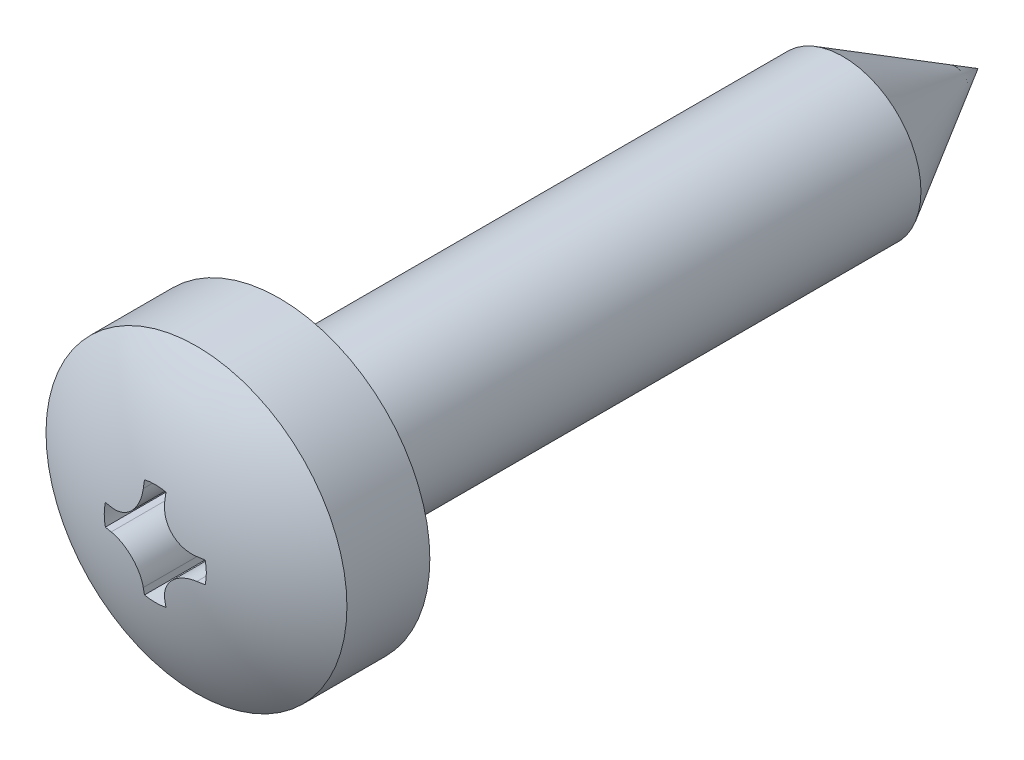
ISO-10303-21;
HEADER;
FILE_DESCRIPTION(('STEP AP214'),'2;1');
FILE_NAME('part.step','',(''),(''),'','','');
FILE_SCHEMA(('AUTOMOTIVE_DESIGN { 1 0 10303 214 1 1 1 1 }'));
ENDSEC;
DATA;
#1=APPLICATION_CONTEXT('core data for automotive mechanical design processes');
#2=APPLICATION_PROTOCOL_DEFINITION('international standard','automotive_design',2000,#1);
#3=PRODUCT_CONTEXT('',#1,'mechanical');
#4=PRODUCT('Part','Part','',(#3));
#5=PRODUCT_RELATED_PRODUCT_CATEGORY('part','',(#4));
#6=PRODUCT_DEFINITION_FORMATION('','',#4);
#7=PRODUCT_DEFINITION_CONTEXT('part definition',#1,'design');
#8=PRODUCT_DEFINITION('design','',#6,#7);
#9=PRODUCT_DEFINITION_SHAPE('','',#8);
#10=(LENGTH_UNIT() NAMED_UNIT(*) SI_UNIT(.MILLI.,.METRE.));
#11=(NAMED_UNIT(*) PLANE_ANGLE_UNIT() SI_UNIT($,.RADIAN.));
#12=(NAMED_UNIT(*) SI_UNIT($,.STERADIAN.) SOLID_ANGLE_UNIT());
#13=UNCERTAINTY_MEASURE_WITH_UNIT(LENGTH_MEASURE(1.E-05),#10,'distance_accuracy_value','');
#14=(GEOMETRIC_REPRESENTATION_CONTEXT(3) GLOBAL_UNCERTAINTY_ASSIGNED_CONTEXT((#13)) GLOBAL_UNIT_ASSIGNED_CONTEXT((#10,
#11,#12)) REPRESENTATION_CONTEXT('',''));
#15=CARTESIAN_POINT('',(0.,0.,0.));
#16=DIRECTION('',(0.,0.,1.));
#17=DIRECTION('',(1.,0.,0.));
#18=AXIS2_PLACEMENT_3D('',#15,#16,#17);
#19=CARTESIAN_POINT('',(0.,0.,10.4));
#20=DIRECTION('',(0.,0.,1.));
#21=DIRECTION('',(0.,1.,0.));
#22=AXIS2_PLACEMENT_3D('',#19,#20,#21);
#23=SPHERICAL_SURFACE('',#22,5.);
#24=CARTESIAN_POINT('',(0.,0.,14.5424630354416));
#25=DIRECTION('',(0.,0.,1.));
#26=DIRECTION('',(1.,0.,0.));
#27=AXIS2_PLACEMENT_3D('',#24,#25,#26);
#28=CIRCLE('',#27,2.8);
#29=CARTESIAN_POINT('',(2.8,0.,14.5424630354416));
#30=VERTEX_POINT('',#29);
#31=EDGE_CURVE('E196',#30,#30,#28,.T.);
#32=ORIENTED_EDGE('',*,*,#31,.T.);
#33=EDGE_LOOP('',(#32));
#34=FACE_BOUND('',#33,.T.);
#35=CARTESIAN_POINT('',(0.,0.,15.3089204515861));
#36=DIRECTION('',(0.,0.,-1.));
#37=DIRECTION('',(-1.,0.,0.));
#38=AXIS2_PLACEMENT_3D('',#35,#36,#37);
#39=CIRCLE('',#38,0.95);
#40=CARTESIAN_POINT('',(0.199999999999999,0.928708781050336,15.3089204515861));
#41=VERTEX_POINT('',#40);
#42=CARTESIAN_POINT('',(-0.199999999999997,0.928708781050336,15.3089204515861));
#43=VERTEX_POINT('',#42);
#44=EDGE_CURVE('E304',#41,#43,#39,.F.);
#45=ORIENTED_EDGE('',*,*,#44,.F.);
#46=CARTESIAN_POINT('',(0.200000000000013,0.,10.4));
#47=DIRECTION('',(-1.,0.,0.));
#48=DIRECTION('',(0.,-1.,0.));
#49=AXIS2_PLACEMENT_3D('',#46,#47,#48);
#50=CIRCLE('',#49,4.99599839871872);
#51=CARTESIAN_POINT('',(0.200000000000001,0.797500009462237,15.3319361040982));
#52=VERTEX_POINT('',#51);
#53=EDGE_CURVE('E182',#52,#41,#50,.T.);
#54=ORIENTED_EDGE('',*,*,#53,.F.);
#55=CARTESIAN_POINT('',(0.200000033472805,0.797700009462236,15.3319037583386));
#56=CARTESIAN_POINT('',(0.199959253117828,0.764708817685606,15.3372450026347));
#57=CARTESIAN_POINT('',(0.202709128813232,0.731640466129004,15.3421389681577));
#58=CARTESIAN_POINT('',(0.213653637195818,0.666282732986849,15.3509117634436));
#59=CARTESIAN_POINT('',(0.221847801353419,0.633993284617508,15.3547906805205));
#60=CARTESIAN_POINT('',(0.243555568778322,0.571088201610532,15.3614171793675));
#61=CARTESIAN_POINT('',(0.257074653927373,0.540474329048727,15.364163589265));
#62=CARTESIAN_POINT('',(0.289068737352572,0.481878485435129,15.3684353734394));
#63=CARTESIAN_POINT('',(0.307541534947129,0.453895353117194,15.3699612887238));
#64=CARTESIAN_POINT('',(0.348646595686665,0.401741777280698,15.371733860277));
#65=CARTESIAN_POINT('',(0.371219136327946,0.377524829205055,15.3719975623989));
#66=CARTESIAN_POINT('',(0.42004221247523,0.33315104363588,15.3712838517845));
#67=CARTESIAN_POINT('',(0.446293163672993,0.312994665649831,15.3703062986749));
#68=CARTESIAN_POINT('',(0.501529122246131,0.277422821121843,15.3671501235125));
#69=CARTESIAN_POINT('',(0.530496065410742,0.261978583187333,15.3649790268822));
#70=CARTESIAN_POINT('',(0.590474078177402,0.236061672214504,15.3595049326867));
#71=CARTESIAN_POINT('',(0.621484749229964,0.225588033102557,15.3562021552872));
#72=CARTESIAN_POINT('',(0.676782180778131,0.211811110107704,15.349515949383));
#73=CARTESIAN_POINT('',(0.700820773823944,0.207371844731834,15.3463573247891));
#74=CARTESIAN_POINT('',(0.749150929493059,0.201461310152338,15.3395132745871));
#75=CARTESIAN_POINT('',(0.773442081704409,0.199985810303452,15.3358286079455));
#76=CARTESIAN_POINT('',(0.797700009462238,0.200000033472804,15.3319037583386));
#77=B_SPLINE_CURVE_WITH_KNOTS('',3,(#55,#56,#57,#58,#59,#60,#61,#62,#63,#64,#65,#66,#67,#68,#69,
#70,#71,#72,#73,#74,#75,#76),.UNSPECIFIED.,.F.,.F.,(4,2,2,2,2,2,2,2,2,2,4),(0.,
0.100151318053274,0.200294018308518,0.30054008372607,0.400741688499828,0.499586204595047,
0.598441899985654,0.696681331546744,0.794901661700852,0.868668187611341,0.942329339997771),.UNSPECIFIED.);
#78=CARTESIAN_POINT('',(0.797500009462238,0.2,15.3319361040982));
#79=VERTEX_POINT('',#78);
#80=EDGE_CURVE('E294',#52,#79,#77,.T.);
#81=ORIENTED_EDGE('',*,*,#80,.T.);
#82=CARTESIAN_POINT('',(0.,0.200000000000013,10.4));
#83=DIRECTION('',(0.,1.,0.));
#84=DIRECTION('',(-1.,0.,0.));
#85=AXIS2_PLACEMENT_3D('',#82,#83,#84);
#86=CIRCLE('',#85,4.99599839871872);
#87=CARTESIAN_POINT('',(0.928708781050337,0.199999999999998,15.3089204515861));
#88=VERTEX_POINT('',#87);
#89=EDGE_CURVE('E302',#79,#88,#86,.T.);
#90=ORIENTED_EDGE('',*,*,#89,.T.);
#91=CARTESIAN_POINT('',(0.,0.,15.3089204515861));
#92=DIRECTION('',(0.,0.,-1.));
#93=DIRECTION('',(-1.,0.,0.));
#94=AXIS2_PLACEMENT_3D('',#91,#92,#93);
#95=CIRCLE('',#94,0.950000000000001);
#96=CARTESIAN_POINT('',(0.928708781050337,-0.199999999999996,15.3089204515861));
#97=VERTEX_POINT('',#96);
#98=EDGE_CURVE('E380',#88,#97,#95,.T.);
#99=ORIENTED_EDGE('',*,*,#98,.T.);
#100=CARTESIAN_POINT('',(0.,-0.200000000000022,10.4));
#101=DIRECTION('',(0.,1.,0.));
#102=DIRECTION('',(-1.,0.,0.));
#103=AXIS2_PLACEMENT_3D('',#100,#101,#102);
#104=CIRCLE('',#103,4.99599839871872);
#105=CARTESIAN_POINT('',(0.797500009462238,-0.2,15.3319361040982));
#106=VERTEX_POINT('',#105);
#107=EDGE_CURVE('E266',#106,#97,#104,.T.);
#108=ORIENTED_EDGE('',*,*,#107,.F.);
#109=CARTESIAN_POINT('',(0.200000033472805,-0.797700009462236,15.3319037583386));
#110=CARTESIAN_POINT('',(0.199959253117828,-0.764708817685605,15.3372450026347));
#111=CARTESIAN_POINT('',(0.202709128813232,-0.731640466129003,15.3421389681577));
#112=CARTESIAN_POINT('',(0.213653637195818,-0.666282732986848,15.3509117634436));
#113=CARTESIAN_POINT('',(0.221847801353419,-0.633993284617508,15.3547906805205));
#114=CARTESIAN_POINT('',(0.243555568778322,-0.571088201610531,15.3614171793675));
#115=CARTESIAN_POINT('',(0.257074653927373,-0.540474329048727,15.364163589265));
#116=CARTESIAN_POINT('',(0.289068737352572,-0.481878485435129,15.3684353734394));
#117=CARTESIAN_POINT('',(0.30754153494713,-0.453895353117194,15.3699612887238));
#118=CARTESIAN_POINT('',(0.348646595686666,-0.401741777280697,15.371733860277));
#119=CARTESIAN_POINT('',(0.371219136327946,-0.377524829205055,15.3719975623989));
#120=CARTESIAN_POINT('',(0.42004221247523,-0.33315104363588,15.3712838517845));
#121=CARTESIAN_POINT('',(0.446293163672993,-0.31299466564983,15.370306298675));
#122=CARTESIAN_POINT('',(0.501529122246131,-0.277422821121843,15.3671501235125));
#123=CARTESIAN_POINT('',(0.530496065410743,-0.261978583187333,15.3649790268822));
#124=CARTESIAN_POINT('',(0.590474078177402,-0.236061672214504,15.3595049326867));
#125=CARTESIAN_POINT('',(0.621484749229964,-0.225588033102557,15.3562021552872));
#126=CARTESIAN_POINT('',(0.676782180778131,-0.211811110107704,15.349515949383));
#127=CARTESIAN_POINT('',(0.700820773823944,-0.207371844731834,15.3463573247891));
#128=CARTESIAN_POINT('',(0.749150929493059,-0.201461310152338,15.3395132745871));
#129=CARTESIAN_POINT('',(0.773442081704409,-0.199985810303452,15.3358286079455));
#130=CARTESIAN_POINT('',(0.797700009462237,-0.200000033472804,15.3319037583386));
#131=B_SPLINE_CURVE_WITH_KNOTS('',3,(#109,#110,#111,#112,#113,#114,#115,#116,#117,#118,#119,
#120,#121,#122,#123,#124,#125,#126,#127,#128,#129,#130),.UNSPECIFIED.,.F.,.F.,(4,2,2,2,2,2,2,2,
2,2,4),(0.,0.100151318053274,0.200294018308518,0.300540083726071,0.400741688499828,
0.499586204595048,0.598441899985654,0.696681331546745,0.794901661700852,0.868668187611341,
0.94232933999777),.UNSPECIFIED.);
#132=CARTESIAN_POINT('',(0.200000000000001,-0.797500009462237,15.3319361040982));
#133=VERTEX_POINT('',#132);
#134=EDGE_CURVE('E259',#133,#106,#131,.T.);
#135=ORIENTED_EDGE('',*,*,#134,.F.);
#136=CARTESIAN_POINT('',(0.20000000000001,0.,10.4));
#137=DIRECTION('',(1.,0.,0.));
#138=DIRECTION('',(0.,1.,0.));
#139=AXIS2_PLACEMENT_3D('',#136,#137,#138);
#140=CIRCLE('',#139,4.99599839871872);
#141=CARTESIAN_POINT('',(0.199999999999999,-0.928708781050336,15.3089204515861));
#142=VERTEX_POINT('',#141);
#143=EDGE_CURVE('E256',#133,#142,#140,.T.);
#144=ORIENTED_EDGE('',*,*,#143,.T.);
#145=CARTESIAN_POINT('',(0.,0.,15.3089204515861));
#146=DIRECTION('',(0.,0.,-1.));
#147=DIRECTION('',(-1.,0.,0.));
#148=AXIS2_PLACEMENT_3D('',#145,#146,#147);
#149=CIRCLE('',#148,0.95);
#150=CARTESIAN_POINT('',(-0.199999999999997,-0.928708781050336,15.3089204515861));
#151=VERTEX_POINT('',#150);
#152=EDGE_CURVE('E253',#142,#151,#149,.T.);
#153=ORIENTED_EDGE('',*,*,#152,.T.);
#154=CARTESIAN_POINT('',(-0.200000000000015,0.,10.4));
#155=DIRECTION('',(1.,0.,0.));
#156=DIRECTION('',(0.,1.,0.));
#157=AXIS2_PLACEMENT_3D('',#154,#155,#156);
#158=CIRCLE('',#157,4.99599839871872);
#159=CARTESIAN_POINT('',(-0.2,-0.797500009462236,15.3319361040982));
#160=VERTEX_POINT('',#159);
#161=EDGE_CURVE('E250',#160,#151,#158,.T.);
#162=ORIENTED_EDGE('',*,*,#161,.F.);
#163=CARTESIAN_POINT('',(-0.200000033472803,-0.797700009462235,15.3319037583386));
#164=CARTESIAN_POINT('',(-0.199959253117827,-0.764708817685605,15.3372450026347));
#165=CARTESIAN_POINT('',(-0.202709128813231,-0.731640466129003,15.3421389681577));
#166=CARTESIAN_POINT('',(-0.213653637195817,-0.666282732986847,15.3509117634436));
#167=CARTESIAN_POINT('',(-0.221847801353417,-0.633993284617507,15.3547906805205));
#168=CARTESIAN_POINT('',(-0.243555568778321,-0.57108820161053,15.3614171793675));
#169=CARTESIAN_POINT('',(-0.257074653927372,-0.540474329048725,15.364163589265));
#170=CARTESIAN_POINT('',(-0.289068737352571,-0.481878485435128,15.3684353734394));
#171=CARTESIAN_POINT('',(-0.307541534947129,-0.453895353117193,15.3699612887238));
#172=CARTESIAN_POINT('',(-0.348646595686664,-0.401741777280696,15.371733860277));
#173=CARTESIAN_POINT('',(-0.371219136327945,-0.377524829205054,15.3719975623989));
#174=CARTESIAN_POINT('',(-0.420042212475229,-0.333151043635879,15.3712838517845));
#175=CARTESIAN_POINT('',(-0.446293163672992,-0.312994665649829,15.370306298675));
#176=CARTESIAN_POINT('',(-0.50152912224613,-0.277422821121842,15.3671501235125));
#177=CARTESIAN_POINT('',(-0.530496065410741,-0.261978583187332,15.3649790268822));
#178=CARTESIAN_POINT('',(-0.590474078177401,-0.236061672214503,15.3595049326867));
#179=CARTESIAN_POINT('',(-0.621484749229963,-0.225588033102557,15.3562021552872));
#180=CARTESIAN_POINT('',(-0.676782180778129,-0.211811110107703,15.349515949383));
#181=CARTESIAN_POINT('',(-0.700820773823943,-0.207371844731833,15.3463573247891));
#182=CARTESIAN_POINT('',(-0.749150929493057,-0.201461310152337,15.3395132745871));
#183=CARTESIAN_POINT('',(-0.773442081704407,-0.199985810303451,15.3358286079455));
#184=CARTESIAN_POINT('',(-0.797700009462235,-0.200000033472803,15.3319037583386));
#185=B_SPLINE_CURVE_WITH_KNOTS('',3,(#163,#164,#165,#166,#167,#168,#169,#170,#171,#172,#173,
#174,#175,#176,#177,#178,#179,#180,#181,#182,#183,#184),.UNSPECIFIED.,.F.,.F.,(4,2,2,2,2,2,2,2,
2,2,4),(0.,0.100151318053273,0.200294018308518,0.300540083726071,0.400741688499828,
0.499586204595048,0.598441899985654,0.696681331546744,0.794901661700852,0.868668187611341,
0.942329339997769),.UNSPECIFIED.);
#186=CARTESIAN_POINT('',(-0.797500009462236,-0.199999999999999,15.3319361040982));
#187=VERTEX_POINT('',#186);
#188=EDGE_CURVE('E242',#160,#187,#185,.T.);
#189=ORIENTED_EDGE('',*,*,#188,.T.);
#190=CARTESIAN_POINT('',(0.,-0.200000000000015,10.4));
#191=DIRECTION('',(0.,-1.,0.));
#192=DIRECTION('',(1.,0.,0.));
#193=AXIS2_PLACEMENT_3D('',#190,#191,#192);
#194=CIRCLE('',#193,4.99599839871872);
#195=CARTESIAN_POINT('',(-0.928708781050336,-0.199999999999997,15.3089204515861));
#196=VERTEX_POINT('',#195);
#197=EDGE_CURVE('E251',#187,#196,#194,.T.);
#198=ORIENTED_EDGE('',*,*,#197,.T.);
#199=CARTESIAN_POINT('',(0.,0.,15.3089204515861));
#200=DIRECTION('',(0.,0.,-1.));
#201=DIRECTION('',(-1.,0.,0.));
#202=AXIS2_PLACEMENT_3D('',#199,#200,#201);
#203=CIRCLE('',#202,0.95);
#204=CARTESIAN_POINT('',(-0.928708781050336,0.199999999999997,15.3089204515861));
#205=VERTEX_POINT('',#204);
#206=EDGE_CURVE('E419',#205,#196,#203,.F.);
#207=ORIENTED_EDGE('',*,*,#206,.F.);
#208=CARTESIAN_POINT('',(0.,0.200000000000015,10.4));
#209=DIRECTION('',(0.,-1.,0.));
#210=DIRECTION('',(1.,0.,0.));
#211=AXIS2_PLACEMENT_3D('',#208,#209,#210);
#212=CIRCLE('',#211,4.99599839871872);
#213=CARTESIAN_POINT('',(-0.797500009462236,0.199999999999999,15.3319361040982));
#214=VERTEX_POINT('',#213);
#215=EDGE_CURVE('E210',#214,#205,#212,.T.);
#216=ORIENTED_EDGE('',*,*,#215,.F.);
#217=CARTESIAN_POINT('',(-0.200000033472804,0.797700009462235,15.3319037583386));
#218=CARTESIAN_POINT('',(-0.199959253117827,0.764708817685605,15.3372450026347));
#219=CARTESIAN_POINT('',(-0.202709128813231,0.731640466129002,15.3421389681577));
#220=CARTESIAN_POINT('',(-0.213653637195817,0.666282732986847,15.3509117634436));
#221=CARTESIAN_POINT('',(-0.221847801353417,0.633993284617507,15.3547906805205));
#222=CARTESIAN_POINT('',(-0.24355556877832,0.571088201610531,15.3614171793675));
#223=CARTESIAN_POINT('',(-0.257074653927372,0.540474329048726,15.364163589265));
#224=CARTESIAN_POINT('',(-0.28906873735257,0.481878485435128,15.3684353734394));
#225=CARTESIAN_POINT('',(-0.307541534947128,0.453895353117193,15.3699612887238));
#226=CARTESIAN_POINT('',(-0.348646595686664,0.401741777280697,15.371733860277));
#227=CARTESIAN_POINT('',(-0.371219136327945,0.377524829205054,15.3719975623989));
#228=CARTESIAN_POINT('',(-0.420042212475228,0.333151043635879,15.3712838517845));
#229=CARTESIAN_POINT('',(-0.446293163672991,0.31299466564983,15.370306298675));
#230=CARTESIAN_POINT('',(-0.501529122246129,0.277422821121843,15.3671501235125));
#231=CARTESIAN_POINT('',(-0.53049606541074,0.261978583187332,15.3649790268822));
#232=CARTESIAN_POINT('',(-0.5904740781774,0.236061672214503,15.3595049326867));
#233=CARTESIAN_POINT('',(-0.621484749229962,0.225588033102557,15.3562021552872));
#234=CARTESIAN_POINT('',(-0.676782180778129,0.211811110107703,15.349515949383));
#235=CARTESIAN_POINT('',(-0.700820773823943,0.207371844731833,15.3463573247891));
#236=CARTESIAN_POINT('',(-0.749150929493057,0.201461310152337,15.3395132745871));
#237=CARTESIAN_POINT('',(-0.773442081704407,0.199985810303451,15.3358286079455));
#238=CARTESIAN_POINT('',(-0.797700009462235,0.200000033472803,15.3319037583386));
#239=B_SPLINE_CURVE_WITH_KNOTS('',3,(#217,#218,#219,#220,#221,#222,#223,#224,#225,#226,#227,
#228,#229,#230,#231,#232,#233,#234,#235,#236,#237,#238),.UNSPECIFIED.,.F.,.F.,(4,2,2,2,2,2,2,2,
2,2,4),(0.,0.100151318053274,0.200294018308518,0.30054008372607,0.400741688499828,
0.499586204595047,0.598441899985653,0.696681331546744,0.794901661700851,0.868668187611341,
0.94232933999777),.UNSPECIFIED.);
#240=CARTESIAN_POINT('',(-0.2,0.797500009462236,15.3319361040982));
#241=VERTEX_POINT('',#240);
#242=EDGE_CURVE('E202',#241,#214,#239,.T.);
#243=ORIENTED_EDGE('',*,*,#242,.F.);
#244=CARTESIAN_POINT('',(-0.200000000000015,0.,10.4));
#245=DIRECTION('',(-1.,0.,0.));
#246=DIRECTION('',(0.,-1.,0.));
#247=AXIS2_PLACEMENT_3D('',#244,#245,#246);
#248=CIRCLE('',#247,4.99599839871872);
#249=EDGE_CURVE('E199',#241,#43,#248,.T.);
#250=ORIENTED_EDGE('',*,*,#249,.T.);
#251=EDGE_LOOP('',(#45,#54,#81,#90,#99,#108,#135,#144,#153,#162,#189,#198,#207,#216,#243,#250));
#252=FACE_BOUND('',#251,.T.);
#253=ADVANCED_FACE('F47',(#34,#252),#23,.T.);
#254=CARTESIAN_POINT('',(0.,0.,0.));
#255=DIRECTION('',(0.,0.,1.));
#256=DIRECTION('',(1.,0.,0.));
#257=AXIS2_PLACEMENT_3D('',#254,#255,#256);
#258=CONICAL_SURFACE('',#257,0.,0.523598775598293);
#259=CARTESIAN_POINT('',(0.,0.,2.5114736709749));
#260=DIRECTION('',(0.,0.,1.));
#261=DIRECTION('',(1.,0.,0.));
#262=AXIS2_PLACEMENT_3D('',#259,#260,#261);
#263=CIRCLE('',#262,1.45);
#264=CARTESIAN_POINT('',(1.45,0.,2.5114736709749));
#265=VERTEX_POINT('',#264);
#266=EDGE_CURVE('E183',#265,#265,#263,.T.);
#267=ORIENTED_EDGE('',*,*,#266,.F.);
#268=EDGE_LOOP('',(#267));
#269=FACE_BOUND('',#268,.T.);
#270=CARTESIAN_POINT('',(0.,0.,0.));
#271=VERTEX_POINT('',#270);
#272=VERTEX_LOOP('',#271);
#273=FACE_BOUND('',#272,.T.);
#274=ADVANCED_FACE('F319',(#269,#273),#258,.T.);
#275=CARTESIAN_POINT('',(0.,0.,11.71));
#276=DIRECTION('',(0.,0.,1.));
#277=DIRECTION('',(1.,0.,0.));
#278=AXIS2_PLACEMENT_3D('',#275,#276,#277);
#279=CYLINDRICAL_SURFACE('',#278,2.8);
#280=ORIENTED_EDGE('',*,*,#31,.F.);
#281=EDGE_LOOP('',(#280));
#282=FACE_BOUND('',#281,.T.);
#283=CARTESIAN_POINT('',(0.,0.,13.));
#284=DIRECTION('',(0.,0.,1.));
#285=DIRECTION('',(1.,0.,0.));
#286=AXIS2_PLACEMENT_3D('',#283,#284,#285);
#287=CIRCLE('',#286,2.8);
#288=CARTESIAN_POINT('',(2.8,0.,13.));
#289=VERTEX_POINT('',#288);
#290=EDGE_CURVE('E187',#289,#289,#287,.T.);
#291=ORIENTED_EDGE('',*,*,#290,.T.);
#292=EDGE_LOOP('',(#291));
#293=FACE_BOUND('',#292,.T.);
#294=ADVANCED_FACE('F326',(#282,#293),#279,.T.);
#295=CARTESIAN_POINT('',(0.,2.8,13.));
#296=DIRECTION('',(0.,0.,1.));
#297=DIRECTION('',(1.,0.,0.));
#298=AXIS2_PLACEMENT_3D('',#295,#296,#297);
#299=PLANE('',#298);
#300=CARTESIAN_POINT('',(0.,0.,13.));
#301=DIRECTION('',(0.,0.,1.));
#302=DIRECTION('',(1.,0.,0.));
#303=AXIS2_PLACEMENT_3D('',#300,#301,#302);
#304=CIRCLE('',#303,1.55);
#305=CARTESIAN_POINT('',(1.55,0.,13.));
#306=VERTEX_POINT('',#305);
#307=EDGE_CURVE('E56',#306,#306,#304,.T.);
#308=ORIENTED_EDGE('',*,*,#307,.T.);
#309=EDGE_LOOP('',(#308));
#310=FACE_BOUND('',#309,.T.);
#311=ORIENTED_EDGE('',*,*,#290,.F.);
#312=EDGE_LOOP('',(#311));
#313=FACE_BOUND('',#312,.T.);
#314=ADVANCED_FACE('F308',(#310,#313),#299,.F.);
#315=CARTESIAN_POINT('',(0.,0.,11.71));
#316=DIRECTION('',(0.,0.,1.));
#317=DIRECTION('',(1.,0.,0.));
#318=AXIS2_PLACEMENT_3D('',#315,#316,#317);
#319=CYLINDRICAL_SURFACE('',#318,1.45);
#320=CARTESIAN_POINT('',(0.,0.,12.9));
#321=DIRECTION('',(0.,0.,1.));
#322=DIRECTION('',(1.,0.,0.));
#323=AXIS2_PLACEMENT_3D('',#320,#321,#322);
#324=CIRCLE('',#323,1.45);
#325=CARTESIAN_POINT('',(1.45,0.,12.9));
#326=VERTEX_POINT('',#325);
#327=EDGE_CURVE('E11',#326,#326,#324,.F.);
#328=ORIENTED_EDGE('',*,*,#327,.T.);
#329=EDGE_LOOP('',(#328));
#330=FACE_BOUND('',#329,.T.);
#331=ORIENTED_EDGE('',*,*,#266,.T.);
#332=EDGE_LOOP('',(#331));
#333=FACE_BOUND('',#332,.T.);
#334=ADVANCED_FACE('F478',(#330,#333),#319,.T.);
#335=CARTESIAN_POINT('',(0.,0.,14.2));
#336=DIRECTION('',(0.,0.,1.));
#337=DIRECTION('',(1.,0.,0.));
#338=AXIS2_PLACEMENT_3D('',#335,#336,#337);
#339=CYLINDRICAL_SURFACE('',#338,0.95);
#340=ORIENTED_EDGE('',*,*,#44,.T.);
#341=DIRECTION('',(0.,0.,1.));
#342=VECTOR('',#341,1.);
#343=CARTESIAN_POINT('',(-0.199999999999997,0.928708781050336,14.2));
#344=LINE('',#343,#342);
#345=CARTESIAN_POINT('',(-0.199999999999997,0.928708781050336,14.2));
#346=VERTEX_POINT('',#345);
#347=EDGE_CURVE('E63',#346,#43,#344,.T.);
#348=ORIENTED_EDGE('',*,*,#347,.F.);
#349=CARTESIAN_POINT('',(0.,0.,14.2));
#350=DIRECTION('',(0.,0.,-1.));
#351=DIRECTION('',(-1.,0.,0.));
#352=AXIS2_PLACEMENT_3D('',#349,#350,#351);
#353=CIRCLE('',#352,0.95);
#354=CARTESIAN_POINT('',(0.199999999999999,0.928708781050336,14.2));
#355=VERTEX_POINT('',#354);
#356=EDGE_CURVE('E165',#346,#355,#353,.T.);
#357=ORIENTED_EDGE('',*,*,#356,.T.);
#358=DIRECTION('',(0.,0.,1.));
#359=VECTOR('',#358,1.);
#360=CARTESIAN_POINT('',(0.199999999999999,0.928708781050336,14.2));
#361=LINE('',#360,#359);
#362=EDGE_CURVE('E177',#355,#41,#361,.T.);
#363=ORIENTED_EDGE('',*,*,#362,.T.);
#364=EDGE_LOOP('',(#340,#348,#357,#363));
#365=FACE_BOUND('',#364,.T.);
#366=ADVANCED_FACE('F176',(#365),#339,.F.);
#367=CARTESIAN_POINT('',(0.199999999999999,0.928708781050336,14.2));
#368=DIRECTION('',(-1.,0.,0.));
#369=DIRECTION('',(0.,-1.,0.));
#370=AXIS2_PLACEMENT_3D('',#367,#368,#369);
#371=PLANE('',#370);
#372=ORIENTED_EDGE('',*,*,#53,.T.);
#373=ORIENTED_EDGE('',*,*,#362,.F.);
#374=DIRECTION('',(0.,-1.,0.));
#375=VECTOR('',#374,1.);
#376=CARTESIAN_POINT('',(0.199999999999999,0.928708781050336,14.2));
#377=LINE('',#376,#375);
#378=CARTESIAN_POINT('',(0.200000000000001,0.797500009462237,14.2));
#379=VERTEX_POINT('',#378);
#380=EDGE_CURVE('E161',#355,#379,#377,.T.);
#381=ORIENTED_EDGE('',*,*,#380,.T.);
#382=DIRECTION('',(0.,0.,1.));
#383=VECTOR('',#382,1.);
#384=CARTESIAN_POINT('',(0.200000000000001,0.797500009462237,14.2));
#385=LINE('',#384,#383);
#386=EDGE_CURVE('E184',#379,#52,#385,.T.);
#387=ORIENTED_EDGE('',*,*,#386,.T.);
#388=EDGE_LOOP('',(#372,#373,#381,#387));
#389=FACE_BOUND('',#388,.T.);
#390=ADVANCED_FACE('F180',(#389),#371,.T.);
#391=CARTESIAN_POINT('',(0.797500009462238,0.797500009462237,14.2));
#392=DIRECTION('',(0.,0.,1.));
#393=DIRECTION('',(1.,0.,0.));
#394=AXIS2_PLACEMENT_3D('',#391,#392,#393);
#395=CYLINDRICAL_SURFACE('',#394,0.597500009462237);
#396=ORIENTED_EDGE('',*,*,#386,.F.);
#397=CARTESIAN_POINT('',(0.797500009462238,0.797500009462237,14.2));
#398=DIRECTION('',(0.,0.,-1.));
#399=DIRECTION('',(-1.,0.,0.));
#400=AXIS2_PLACEMENT_3D('',#397,#398,#399);
#401=CIRCLE('',#400,0.597500009462237);
#402=CARTESIAN_POINT('',(0.797500009462238,0.2,14.2));
#403=VERTEX_POINT('',#402);
#404=EDGE_CURVE('E168',#403,#379,#401,.T.);
#405=ORIENTED_EDGE('',*,*,#404,.F.);
#406=DIRECTION('',(0.,0.,1.));
#407=VECTOR('',#406,1.);
#408=CARTESIAN_POINT('',(0.797500009462238,0.2,14.2));
#409=LINE('',#408,#407);
#410=EDGE_CURVE('E189',#403,#79,#409,.T.);
#411=ORIENTED_EDGE('',*,*,#410,.T.);
#412=ORIENTED_EDGE('',*,*,#80,.F.);
#413=EDGE_LOOP('',(#396,#405,#411,#412));
#414=FACE_BOUND('',#413,.T.);
#415=ADVANCED_FACE('F286',(#414),#395,.T.);
#416=CARTESIAN_POINT('',(0.928708781050337,0.199999999999998,14.2));
#417=DIRECTION('',(0.,1.,0.));
#418=DIRECTION('',(-1.,0.,0.));
#419=AXIS2_PLACEMENT_3D('',#416,#417,#418);
#420=PLANE('',#419);
#421=ORIENTED_EDGE('',*,*,#410,.F.);
#422=DIRECTION('',(-1.,0.,0.));
#423=VECTOR('',#422,1.);
#424=CARTESIAN_POINT('',(0.928708781050337,0.199999999999998,14.2));
#425=LINE('',#424,#423);
#426=CARTESIAN_POINT('',(0.928708781050337,0.199999999999998,14.2));
#427=VERTEX_POINT('',#426);
#428=EDGE_CURVE('E388',#427,#403,#425,.T.);
#429=ORIENTED_EDGE('',*,*,#428,.F.);
#430=DIRECTION('',(0.,0.,1.));
#431=VECTOR('',#430,1.);
#432=CARTESIAN_POINT('',(0.928708781050337,0.199999999999998,14.2));
#433=LINE('',#432,#431);
#434=EDGE_CURVE('E373',#427,#88,#433,.T.);
#435=ORIENTED_EDGE('',*,*,#434,.T.);
#436=ORIENTED_EDGE('',*,*,#89,.F.);
#437=EDGE_LOOP('',(#421,#429,#435,#436));
#438=FACE_BOUND('',#437,.T.);
#439=ADVANCED_FACE('F282',(#438),#420,.F.);
#440=CARTESIAN_POINT('',(0.,0.,14.2));
#441=DIRECTION('',(0.,0.,1.));
#442=DIRECTION('',(1.,0.,0.));
#443=AXIS2_PLACEMENT_3D('',#440,#441,#442);
#444=CYLINDRICAL_SURFACE('',#443,0.950000000000001);
#445=ORIENTED_EDGE('',*,*,#434,.F.);
#446=CARTESIAN_POINT('',(0.,0.,14.2));
#447=DIRECTION('',(0.,0.,1.));
#448=DIRECTION('',(1.,0.,0.));
#449=AXIS2_PLACEMENT_3D('',#446,#447,#448);
#450=CIRCLE('',#449,0.950000000000001);
#451=CARTESIAN_POINT('',(0.928708781050337,-0.199999999999997,14.2));
#452=VERTEX_POINT('',#451);
#453=EDGE_CURVE('E386',#452,#427,#450,.T.);
#454=ORIENTED_EDGE('',*,*,#453,.F.);
#455=DIRECTION('',(0.,0.,1.));
#456=VECTOR('',#455,1.);
#457=CARTESIAN_POINT('',(0.928708781050337,-0.199999999999997,14.2));
#458=LINE('',#457,#456);
#459=EDGE_CURVE('E370',#452,#97,#458,.T.);
#460=ORIENTED_EDGE('',*,*,#459,.T.);
#461=ORIENTED_EDGE('',*,*,#98,.F.);
#462=EDGE_LOOP('',(#445,#454,#460,#461));
#463=FACE_BOUND('',#462,.T.);
#464=ADVANCED_FACE('F278',(#463),#444,.F.);
#465=CARTESIAN_POINT('',(0.928708781050338,-0.199999999999996,14.2));
#466=DIRECTION('',(0.,1.,0.));
#467=DIRECTION('',(-1.,0.,0.));
#468=AXIS2_PLACEMENT_3D('',#465,#466,#467);
#469=PLANE('',#468);
#470=ORIENTED_EDGE('',*,*,#107,.T.);
#471=ORIENTED_EDGE('',*,*,#459,.F.);
#472=DIRECTION('',(-1.,0.,0.));
#473=VECTOR('',#472,1.);
#474=CARTESIAN_POINT('',(0.928708781050338,-0.199999999999996,14.2));
#475=LINE('',#474,#473);
#476=CARTESIAN_POINT('',(0.797500009462238,-0.2,14.2));
#477=VERTEX_POINT('',#476);
#478=EDGE_CURVE('E387',#452,#477,#475,.T.);
#479=ORIENTED_EDGE('',*,*,#478,.T.);
#480=DIRECTION('',(0.,0.,1.));
#481=VECTOR('',#480,1.);
#482=CARTESIAN_POINT('',(0.797500009462238,-0.2,14.2));
#483=LINE('',#482,#481);
#484=EDGE_CURVE('E367',#477,#106,#483,.T.);
#485=ORIENTED_EDGE('',*,*,#484,.T.);
#486=EDGE_LOOP('',(#470,#471,#479,#485));
#487=FACE_BOUND('',#486,.T.);
#488=ADVANCED_FACE('F274',(#487),#469,.T.);
#489=CARTESIAN_POINT('',(0.797500009462238,-0.797500009462237,14.2));
#490=DIRECTION('',(0.,0.,1.));
#491=DIRECTION('',(1.,0.,0.));
#492=AXIS2_PLACEMENT_3D('',#489,#490,#491);
#493=CYLINDRICAL_SURFACE('',#492,0.597500009462237);
#494=ORIENTED_EDGE('',*,*,#134,.T.);
#495=ORIENTED_EDGE('',*,*,#484,.F.);
#496=CARTESIAN_POINT('',(0.797500009462238,-0.797500009462237,14.2));
#497=DIRECTION('',(0.,0.,1.));
#498=DIRECTION('',(1.,0.,0.));
#499=AXIS2_PLACEMENT_3D('',#496,#497,#498);
#500=CIRCLE('',#499,0.597500009462237);
#501=CARTESIAN_POINT('',(0.200000000000001,-0.797500009462237,14.2));
#502=VERTEX_POINT('',#501);
#503=EDGE_CURVE('E390',#477,#502,#500,.T.);
#504=ORIENTED_EDGE('',*,*,#503,.T.);
#505=DIRECTION('',(0.,0.,1.));
#506=VECTOR('',#505,1.);
#507=CARTESIAN_POINT('',(0.200000000000001,-0.797500009462237,14.2));
#508=LINE('',#507,#506);
#509=EDGE_CURVE('E364',#502,#133,#508,.T.);
#510=ORIENTED_EDGE('',*,*,#509,.T.);
#511=EDGE_LOOP('',(#494,#495,#504,#510));
#512=FACE_BOUND('',#511,.T.);
#513=ADVANCED_FACE('F268',(#512),#493,.T.);
#514=CARTESIAN_POINT('',(0.199999999999999,-0.928708781050336,14.2));
#515=DIRECTION('',(1.,0.,0.));
#516=DIRECTION('',(0.,1.,0.));
#517=AXIS2_PLACEMENT_3D('',#514,#515,#516);
#518=PLANE('',#517);
#519=ORIENTED_EDGE('',*,*,#509,.F.);
#520=DIRECTION('',(0.,1.,0.));
#521=VECTOR('',#520,1.);
#522=CARTESIAN_POINT('',(0.199999999999999,-0.928708781050336,14.2));
#523=LINE('',#522,#521);
#524=CARTESIAN_POINT('',(0.199999999999999,-0.928708781050336,14.2));
#525=VERTEX_POINT('',#524);
#526=EDGE_CURVE('E396',#525,#502,#523,.T.);
#527=ORIENTED_EDGE('',*,*,#526,.F.);
#528=DIRECTION('',(0.,0.,1.));
#529=VECTOR('',#528,1.);
#530=CARTESIAN_POINT('',(0.199999999999999,-0.928708781050336,14.2));
#531=LINE('',#530,#529);
#532=EDGE_CURVE('E361',#525,#142,#531,.T.);
#533=ORIENTED_EDGE('',*,*,#532,.T.);
#534=ORIENTED_EDGE('',*,*,#143,.F.);
#535=EDGE_LOOP('',(#519,#527,#533,#534));
#536=FACE_BOUND('',#535,.T.);
#537=ADVANCED_FACE('F273',(#536),#518,.F.);
#538=CARTESIAN_POINT('',(0.,0.,14.2));
#539=DIRECTION('',(0.,0.,1.));
#540=DIRECTION('',(1.,0.,0.));
#541=AXIS2_PLACEMENT_3D('',#538,#539,#540);
#542=CYLINDRICAL_SURFACE('',#541,0.95);
#543=ORIENTED_EDGE('',*,*,#532,.F.);
#544=CARTESIAN_POINT('',(0.,0.,14.2));
#545=DIRECTION('',(0.,0.,1.));
#546=DIRECTION('',(1.,0.,0.));
#547=AXIS2_PLACEMENT_3D('',#544,#545,#546);
#548=CIRCLE('',#547,0.95);
#549=CARTESIAN_POINT('',(-0.199999999999997,-0.928708781050336,14.2));
#550=VERTEX_POINT('',#549);
#551=EDGE_CURVE('E399',#550,#525,#548,.T.);
#552=ORIENTED_EDGE('',*,*,#551,.F.);
#553=DIRECTION('',(0.,0.,1.));
#554=VECTOR('',#553,1.);
#555=CARTESIAN_POINT('',(-0.199999999999997,-0.928708781050336,14.2));
#556=LINE('',#555,#554);
#557=EDGE_CURVE('E358',#550,#151,#556,.T.);
#558=ORIENTED_EDGE('',*,*,#557,.T.);
#559=ORIENTED_EDGE('',*,*,#152,.F.);
#560=EDGE_LOOP('',(#543,#552,#558,#559));
#561=FACE_BOUND('',#560,.T.);
#562=ADVANCED_FACE('F428',(#561),#542,.F.);
#563=CARTESIAN_POINT('',(-0.199999999999997,-0.928708781050336,14.2));
#564=DIRECTION('',(1.,0.,0.));
#565=DIRECTION('',(0.,1.,0.));
#566=AXIS2_PLACEMENT_3D('',#563,#564,#565);
#567=PLANE('',#566);
#568=ORIENTED_EDGE('',*,*,#161,.T.);
#569=ORIENTED_EDGE('',*,*,#557,.F.);
#570=DIRECTION('',(0.,1.,0.));
#571=VECTOR('',#570,1.);
#572=CARTESIAN_POINT('',(-0.199999999999997,-0.928708781050336,14.2));
#573=LINE('',#572,#571);
#574=CARTESIAN_POINT('',(-0.2,-0.797500009462236,14.2));
#575=VERTEX_POINT('',#574);
#576=EDGE_CURVE('E402',#550,#575,#573,.T.);
#577=ORIENTED_EDGE('',*,*,#576,.T.);
#578=DIRECTION('',(0.,0.,1.));
#579=VECTOR('',#578,1.);
#580=CARTESIAN_POINT('',(-0.2,-0.797500009462236,14.2));
#581=LINE('',#580,#579);
#582=EDGE_CURVE('E355',#575,#160,#581,.T.);
#583=ORIENTED_EDGE('',*,*,#582,.T.);
#584=EDGE_LOOP('',(#568,#569,#577,#583));
#585=FACE_BOUND('',#584,.T.);
#586=ADVANCED_FACE('F238',(#585),#567,.T.);
#587=CARTESIAN_POINT('',(-0.797500009462237,-0.797500009462236,14.2));
#588=DIRECTION('',(0.,0.,1.));
#589=DIRECTION('',(1.,0.,0.));
#590=AXIS2_PLACEMENT_3D('',#587,#588,#589);
#591=CYLINDRICAL_SURFACE('',#590,0.597500009462237);
#592=ORIENTED_EDGE('',*,*,#582,.F.);
#593=CARTESIAN_POINT('',(-0.797500009462237,-0.797500009462236,14.2));
#594=DIRECTION('',(0.,0.,-1.));
#595=DIRECTION('',(-1.,0.,0.));
#596=AXIS2_PLACEMENT_3D('',#593,#594,#595);
#597=CIRCLE('',#596,0.597500009462237);
#598=CARTESIAN_POINT('',(-0.797500009462236,-0.199999999999999,14.2));
#599=VERTEX_POINT('',#598);
#600=EDGE_CURVE('E404',#599,#575,#597,.T.);
#601=ORIENTED_EDGE('',*,*,#600,.F.);
#602=DIRECTION('',(0.,0.,1.));
#603=VECTOR('',#602,1.);
#604=CARTESIAN_POINT('',(-0.797500009462236,-0.199999999999999,14.2));
#605=LINE('',#604,#603);
#606=EDGE_CURVE('E352',#599,#187,#605,.T.);
#607=ORIENTED_EDGE('',*,*,#606,.T.);
#608=ORIENTED_EDGE('',*,*,#188,.F.);
#609=EDGE_LOOP('',(#592,#601,#607,#608));
#610=FACE_BOUND('',#609,.T.);
#611=ADVANCED_FACE('F233',(#610),#591,.T.);
#612=CARTESIAN_POINT('',(-0.928708781050336,-0.199999999999997,14.2));
#613=DIRECTION('',(0.,-1.,0.));
#614=DIRECTION('',(1.,0.,0.));
#615=AXIS2_PLACEMENT_3D('',#612,#613,#614);
#616=PLANE('',#615);
#617=ORIENTED_EDGE('',*,*,#606,.F.);
#618=DIRECTION('',(1.,0.,0.));
#619=VECTOR('',#618,1.);
#620=CARTESIAN_POINT('',(-0.928708781050336,-0.199999999999997,14.2));
#621=LINE('',#620,#619);
#622=CARTESIAN_POINT('',(-0.928708781050336,-0.199999999999997,14.2));
#623=VERTEX_POINT('',#622);
#624=EDGE_CURVE('E407',#623,#599,#621,.T.);
#625=ORIENTED_EDGE('',*,*,#624,.F.);
#626=DIRECTION('',(0.,0.,1.));
#627=VECTOR('',#626,1.);
#628=CARTESIAN_POINT('',(-0.928708781050336,-0.199999999999997,14.2));
#629=LINE('',#628,#627);
#630=EDGE_CURVE('E349',#623,#196,#629,.T.);
#631=ORIENTED_EDGE('',*,*,#630,.T.);
#632=ORIENTED_EDGE('',*,*,#197,.F.);
#633=EDGE_LOOP('',(#617,#625,#631,#632));
#634=FACE_BOUND('',#633,.T.);
#635=ADVANCED_FACE('F229',(#634),#616,.F.);
#636=CARTESIAN_POINT('',(0.,0.,14.2));
#637=DIRECTION('',(0.,0.,1.));
#638=DIRECTION('',(1.,0.,0.));
#639=AXIS2_PLACEMENT_3D('',#636,#637,#638);
#640=CYLINDRICAL_SURFACE('',#639,0.95);
#641=ORIENTED_EDGE('',*,*,#206,.T.);
#642=ORIENTED_EDGE('',*,*,#630,.F.);
#643=CARTESIAN_POINT('',(0.,0.,14.2));
#644=DIRECTION('',(0.,0.,-1.));
#645=DIRECTION('',(-1.,0.,0.));
#646=AXIS2_PLACEMENT_3D('',#643,#644,#645);
#647=CIRCLE('',#646,0.95);
#648=CARTESIAN_POINT('',(-0.928708781050336,0.199999999999996,14.2));
#649=VERTEX_POINT('',#648);
#650=EDGE_CURVE('E410',#623,#649,#647,.T.);
#651=ORIENTED_EDGE('',*,*,#650,.T.);
#652=DIRECTION('',(0.,0.,1.));
#653=VECTOR('',#652,1.);
#654=CARTESIAN_POINT('',(-0.928708781050336,0.199999999999996,14.2));
#655=LINE('',#654,#653);
#656=EDGE_CURVE('E341',#649,#205,#655,.T.);
#657=ORIENTED_EDGE('',*,*,#656,.T.);
#658=EDGE_LOOP('',(#641,#642,#651,#657));
#659=FACE_BOUND('',#658,.T.);
#660=ADVANCED_FACE('F225',(#659),#640,.F.);
#661=CARTESIAN_POINT('',(-0.928708781050336,0.199999999999997,14.2));
#662=DIRECTION('',(0.,-1.,0.));
#663=DIRECTION('',(1.,0.,0.));
#664=AXIS2_PLACEMENT_3D('',#661,#662,#663);
#665=PLANE('',#664);
#666=ORIENTED_EDGE('',*,*,#215,.T.);
#667=ORIENTED_EDGE('',*,*,#656,.F.);
#668=DIRECTION('',(1.,0.,0.));
#669=VECTOR('',#668,1.);
#670=CARTESIAN_POINT('',(-0.928708781050336,0.199999999999997,14.2));
#671=LINE('',#670,#669);
#672=CARTESIAN_POINT('',(-0.797500009462236,0.199999999999999,14.2));
#673=VERTEX_POINT('',#672);
#674=EDGE_CURVE('E412',#649,#673,#671,.T.);
#675=ORIENTED_EDGE('',*,*,#674,.T.);
#676=DIRECTION('',(0.,0.,1.));
#677=VECTOR('',#676,1.);
#678=CARTESIAN_POINT('',(-0.797500009462236,0.199999999999999,14.2));
#679=LINE('',#678,#677);
#680=EDGE_CURVE('E339',#673,#214,#679,.T.);
#681=ORIENTED_EDGE('',*,*,#680,.T.);
#682=EDGE_LOOP('',(#666,#667,#675,#681));
#683=FACE_BOUND('',#682,.T.);
#684=ADVANCED_FACE('F220',(#683),#665,.T.);
#685=CARTESIAN_POINT('',(-0.797500009462237,0.797500009462236,14.2));
#686=DIRECTION('',(0.,0.,1.));
#687=DIRECTION('',(1.,0.,0.));
#688=AXIS2_PLACEMENT_3D('',#685,#686,#687);
#689=CYLINDRICAL_SURFACE('',#688,0.597500009462237);
#690=ORIENTED_EDGE('',*,*,#242,.T.);
#691=ORIENTED_EDGE('',*,*,#680,.F.);
#692=CARTESIAN_POINT('',(-0.797500009462237,0.797500009462236,14.2));
#693=DIRECTION('',(0.,0.,1.));
#694=DIRECTION('',(1.,0.,0.));
#695=AXIS2_PLACEMENT_3D('',#692,#693,#694);
#696=CIRCLE('',#695,0.597500009462237);
#697=CARTESIAN_POINT('',(-0.2,0.797500009462236,14.2));
#698=VERTEX_POINT('',#697);
#699=EDGE_CURVE('E338',#673,#698,#696,.T.);
#700=ORIENTED_EDGE('',*,*,#699,.T.);
#701=DIRECTION('',(0.,0.,1.));
#702=VECTOR('',#701,1.);
#703=CARTESIAN_POINT('',(-0.2,0.797500009462236,14.2));
#704=LINE('',#703,#702);
#705=EDGE_CURVE('E334',#698,#241,#704,.T.);
#706=ORIENTED_EDGE('',*,*,#705,.T.);
#707=EDGE_LOOP('',(#690,#691,#700,#706));
#708=FACE_BOUND('',#707,.T.);
#709=ADVANCED_FACE('F214',(#708),#689,.T.);
#710=CARTESIAN_POINT('',(-0.199999999999997,0.928708781050336,14.2));
#711=DIRECTION('',(-1.,0.,0.));
#712=DIRECTION('',(0.,-1.,0.));
#713=AXIS2_PLACEMENT_3D('',#710,#711,#712);
#714=PLANE('',#713);
#715=ORIENTED_EDGE('',*,*,#705,.F.);
#716=DIRECTION('',(0.,-1.,0.));
#717=VECTOR('',#716,1.);
#718=CARTESIAN_POINT('',(-0.199999999999997,0.928708781050336,14.2));
#719=LINE('',#718,#717);
#720=EDGE_CURVE('E343',#346,#698,#719,.T.);
#721=ORIENTED_EDGE('',*,*,#720,.F.);
#722=ORIENTED_EDGE('',*,*,#347,.T.);
#723=ORIENTED_EDGE('',*,*,#249,.F.);
#724=EDGE_LOOP('',(#715,#721,#722,#723));
#725=FACE_BOUND('',#724,.T.);
#726=ADVANCED_FACE('F219',(#725),#714,.F.);
#727=CARTESIAN_POINT('',(0.,0.,14.2));
#728=DIRECTION('',(0.,0.,-1.));
#729=DIRECTION('',(-1.,0.,0.));
#730=AXIS2_PLACEMENT_3D('',#727,#728,#729);
#731=PLANE('',#730);
#732=ORIENTED_EDGE('',*,*,#356,.F.);
#733=ORIENTED_EDGE('',*,*,#720,.T.);
#734=ORIENTED_EDGE('',*,*,#699,.F.);
#735=ORIENTED_EDGE('',*,*,#674,.F.);
#736=ORIENTED_EDGE('',*,*,#650,.F.);
#737=ORIENTED_EDGE('',*,*,#624,.T.);
#738=ORIENTED_EDGE('',*,*,#600,.T.);
#739=ORIENTED_EDGE('',*,*,#576,.F.);
#740=ORIENTED_EDGE('',*,*,#551,.T.);
#741=ORIENTED_EDGE('',*,*,#526,.T.);
#742=ORIENTED_EDGE('',*,*,#503,.F.);
#743=ORIENTED_EDGE('',*,*,#478,.F.);
#744=ORIENTED_EDGE('',*,*,#453,.T.);
#745=ORIENTED_EDGE('',*,*,#428,.T.);
#746=ORIENTED_EDGE('',*,*,#404,.T.);
#747=ORIENTED_EDGE('',*,*,#380,.F.);
#748=EDGE_LOOP('',(#732,#733,#734,#735,#736,#737,#738,#739,#740,#741,#742,#743,#744,#745,#746,#747));
#749=FACE_BOUND('',#748,.T.);
#750=ADVANCED_FACE('F163',(#749),#731,.F.);
#751=CARTESIAN_POINT('',(0.,0.,12.9));
#752=DIRECTION('',(0.,0.,1.));
#753=DIRECTION('',(1.,0.,0.));
#754=AXIS2_PLACEMENT_3D('',#751,#752,#753);
#755=TOROIDAL_SURFACE('',#754,1.55,0.1);
#756=ORIENTED_EDGE('',*,*,#327,.F.);
#757=EDGE_LOOP('',(#756));
#758=FACE_BOUND('',#757,.T.);
#759=ORIENTED_EDGE('',*,*,#307,.F.);
#760=EDGE_LOOP('',(#759));
#761=FACE_BOUND('',#760,.T.);
#762=ADVANCED_FACE('F49',(#758,#761),#755,.F.);
#763=CLOSED_SHELL('',(#253,#274,#294,#314,#334,#366,#390,#415,#439,#464,#488,#513,#537,#562,
#586,#611,#635,#660,#684,#709,#726,#750,#762));
#764=MANIFOLD_SOLID_BREP('B2',#763);
#765=ADVANCED_BREP_SHAPE_REPRESENTATION('',(#18,#764),#14);
#766=SHAPE_DEFINITION_REPRESENTATION(#9,#765);
ENDSEC;
END-ISO-10303-21;
